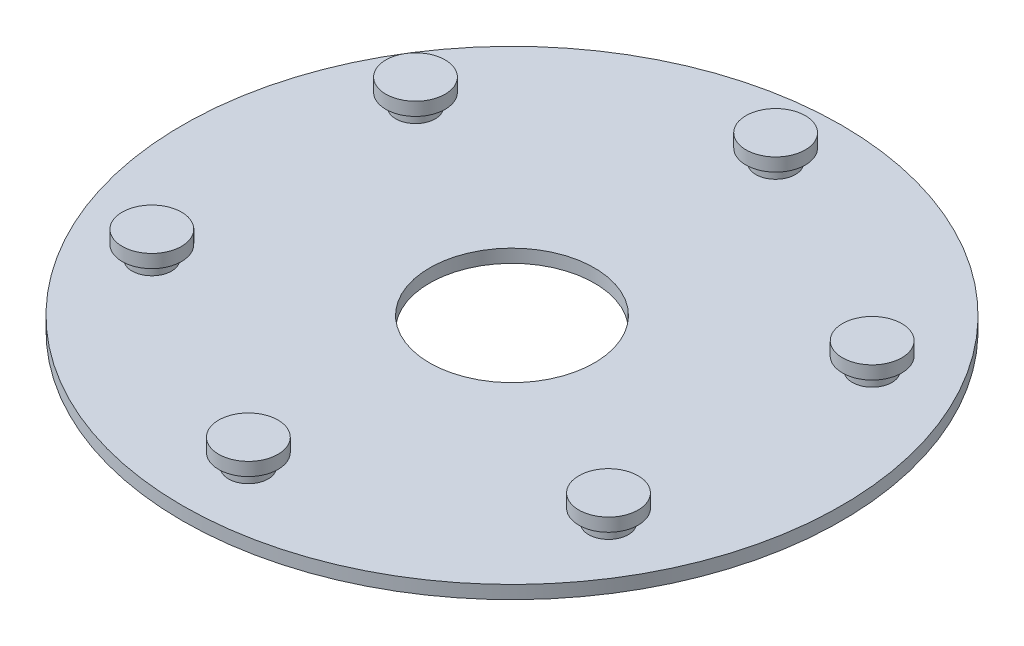
ISO-10303-21;
HEADER;
FILE_DESCRIPTION(('STEP AP214'),'2;1');
FILE_NAME('part.step','',(''),(''),'','','');
FILE_SCHEMA(('AUTOMOTIVE_DESIGN { 1 0 10303 214 1 1 1 1 }'));
ENDSEC;
DATA;
#1=APPLICATION_CONTEXT('core data for automotive mechanical design processes');
#2=APPLICATION_PROTOCOL_DEFINITION('international standard','automotive_design',2000,#1);
#3=PRODUCT_CONTEXT('',#1,'mechanical');
#4=PRODUCT('Part','Part','',(#3));
#5=PRODUCT_RELATED_PRODUCT_CATEGORY('part','',(#4));
#6=PRODUCT_DEFINITION_FORMATION('','',#4);
#7=PRODUCT_DEFINITION_CONTEXT('part definition',#1,'design');
#8=PRODUCT_DEFINITION('design','',#6,#7);
#9=PRODUCT_DEFINITION_SHAPE('','',#8);
#10=(LENGTH_UNIT() NAMED_UNIT(*) SI_UNIT(.MILLI.,.METRE.));
#11=(NAMED_UNIT(*) PLANE_ANGLE_UNIT() SI_UNIT($,.RADIAN.));
#12=(NAMED_UNIT(*) SI_UNIT($,.STERADIAN.) SOLID_ANGLE_UNIT());
#13=UNCERTAINTY_MEASURE_WITH_UNIT(LENGTH_MEASURE(1.E-05),#10,'distance_accuracy_value','');
#14=(GEOMETRIC_REPRESENTATION_CONTEXT(3) GLOBAL_UNCERTAINTY_ASSIGNED_CONTEXT((#13)) GLOBAL_UNIT_ASSIGNED_CONTEXT((#10,
#11,#12)) REPRESENTATION_CONTEXT('',''));
#15=CARTESIAN_POINT('',(0.,0.,0.));
#16=DIRECTION('',(0.,0.,1.));
#17=DIRECTION('',(1.,0.,0.));
#18=AXIS2_PLACEMENT_3D('',#15,#16,#17);
#19=CARTESIAN_POINT('',(0.,2.,0.));
#20=DIRECTION('',(0.,-1.,0.));
#21=DIRECTION('',(0.,0.,-1.));
#22=AXIS2_PLACEMENT_3D('',#19,#20,#21);
#23=CYLINDRICAL_SURFACE('',#22,50.);
#24=CARTESIAN_POINT('',(0.,2.,0.));
#25=DIRECTION('',(0.,1.,0.));
#26=DIRECTION('',(0.,0.,1.));
#27=AXIS2_PLACEMENT_3D('',#24,#25,#26);
#28=CIRCLE('',#27,50.);
#29=CARTESIAN_POINT('',(0.,2.,50.));
#30=VERTEX_POINT('',#29);
#31=EDGE_CURVE('E11',#30,#30,#28,.T.);
#32=ORIENTED_EDGE('',*,*,#31,.F.);
#33=EDGE_LOOP('',(#32));
#34=FACE_BOUND('',#33,.T.);
#35=CARTESIAN_POINT('',(0.,0.,0.));
#36=DIRECTION('',(0.,1.,0.));
#37=DIRECTION('',(0.,0.,1.));
#38=AXIS2_PLACEMENT_3D('',#35,#36,#37);
#39=CIRCLE('',#38,50.);
#40=CARTESIAN_POINT('',(0.,0.,50.));
#41=VERTEX_POINT('',#40);
#42=EDGE_CURVE('E73',#41,#41,#39,.T.);
#43=ORIENTED_EDGE('',*,*,#42,.T.);
#44=EDGE_LOOP('',(#43));
#45=FACE_BOUND('',#44,.T.);
#46=ADVANCED_FACE('F70',(#34,#45),#23,.T.);
#47=CARTESIAN_POINT('',(0.,2.,0.));
#48=DIRECTION('',(0.,1.,0.));
#49=DIRECTION('',(0.,0.,1.));
#50=AXIS2_PLACEMENT_3D('',#47,#48,#49);
#51=PLANE('',#50);
#52=CARTESIAN_POINT('',(0.,2.,0.));
#53=DIRECTION('',(0.,1.,0.));
#54=DIRECTION('',(0.,0.,1.));
#55=AXIS2_PLACEMENT_3D('',#52,#53,#54);
#56=CIRCLE('',#55,12.5);
#57=CARTESIAN_POINT('',(0.,2.,12.5));
#58=VERTEX_POINT('',#57);
#59=EDGE_CURVE('E88',#58,#58,#56,.T.);
#60=ORIENTED_EDGE('',*,*,#59,.F.);
#61=EDGE_LOOP('',(#60));
#62=FACE_BOUND('',#61,.T.);
#63=ORIENTED_EDGE('',*,*,#31,.T.);
#64=EDGE_LOOP('',(#63));
#65=FACE_BOUND('',#64,.T.);
#66=CARTESIAN_POINT('',(0.,2.,40.));
#67=DIRECTION('',(0.,1.,0.));
#68=DIRECTION('',(0.,0.,1.));
#69=AXIS2_PLACEMENT_3D('',#66,#67,#68);
#70=CIRCLE('',#69,3.);
#71=CARTESIAN_POINT('',(0.,2.,43.));
#72=VERTEX_POINT('',#71);
#73=EDGE_CURVE('E101',#72,#72,#70,.T.);
#74=ORIENTED_EDGE('',*,*,#73,.F.);
#75=EDGE_LOOP('',(#74));
#76=FACE_BOUND('',#75,.T.);
#77=CARTESIAN_POINT('',(-34.6410161513773,2.,20.0000000000004));
#78=DIRECTION('',(0.,1.,0.));
#79=DIRECTION('',(-0.866025403784433,0.,0.50000000000001));
#80=AXIS2_PLACEMENT_3D('',#77,#78,#79);
#81=CIRCLE('',#80,3.);
#82=CARTESIAN_POINT('',(-37.2390923627306,2.,21.5000000000004));
#83=VERTEX_POINT('',#82);
#84=EDGE_CURVE('E147',#83,#83,#81,.T.);
#85=ORIENTED_EDGE('',*,*,#84,.F.);
#86=EDGE_LOOP('',(#85));
#87=FACE_BOUND('',#86,.T.);
#88=CARTESIAN_POINT('',(-34.6410161513777,2.,-19.9999999999997));
#89=DIRECTION('',(0.,1.,0.));
#90=DIRECTION('',(-0.866025403784443,0.,-0.499999999999992));
#91=AXIS2_PLACEMENT_3D('',#88,#89,#90);
#92=CIRCLE('',#91,3.);
#93=CARTESIAN_POINT('',(-37.2390923627311,2.,-21.4999999999997));
#94=VERTEX_POINT('',#93);
#95=EDGE_CURVE('E145',#94,#94,#92,.T.);
#96=ORIENTED_EDGE('',*,*,#95,.F.);
#97=EDGE_LOOP('',(#96));
#98=FACE_BOUND('',#97,.T.);
#99=CARTESIAN_POINT('',(0.,2.,-40.));
#100=DIRECTION('',(0.,1.,0.));
#101=DIRECTION('',(0.,0.,-1.));
#102=AXIS2_PLACEMENT_3D('',#99,#100,#101);
#103=CIRCLE('',#102,3.);
#104=CARTESIAN_POINT('',(0.,2.,-43.));
#105=VERTEX_POINT('',#104);
#106=EDGE_CURVE('E158',#105,#105,#103,.T.);
#107=ORIENTED_EDGE('',*,*,#106,.F.);
#108=EDGE_LOOP('',(#107));
#109=FACE_BOUND('',#108,.T.);
#110=CARTESIAN_POINT('',(34.6410161513775,2.,-20.0000000000002));
#111=DIRECTION('',(0.,1.,0.));
#112=DIRECTION('',(0.866025403784436,0.,-0.500000000000004));
#113=AXIS2_PLACEMENT_3D('',#110,#111,#112);
#114=CIRCLE('',#113,3.);
#115=CARTESIAN_POINT('',(37.2390923627308,2.,-21.5000000000002));
#116=VERTEX_POINT('',#115);
#117=EDGE_CURVE('E170',#116,#116,#114,.T.);
#118=ORIENTED_EDGE('',*,*,#117,.F.);
#119=EDGE_LOOP('',(#118));
#120=FACE_BOUND('',#119,.T.);
#121=CARTESIAN_POINT('',(34.6410161513776,2.,19.9999999999999));
#122=DIRECTION('',(0.,1.,0.));
#123=DIRECTION('',(0.86602540378444,0.,0.499999999999998));
#124=AXIS2_PLACEMENT_3D('',#121,#122,#123);
#125=CIRCLE('',#124,3.);
#126=CARTESIAN_POINT('',(37.2390923627309,2.,21.4999999999999));
#127=VERTEX_POINT('',#126);
#128=EDGE_CURVE('E133',#127,#127,#125,.T.);
#129=ORIENTED_EDGE('',*,*,#128,.F.);
#130=EDGE_LOOP('',(#129));
#131=FACE_BOUND('',#130,.T.);
#132=ADVANCED_FACE('F199',(#62,#65,#76,#87,#98,#109,#120,#131),#51,.T.);
#133=CARTESIAN_POINT('',(0.,0.,0.));
#134=DIRECTION('',(0.,1.,0.));
#135=DIRECTION('',(0.,0.,1.));
#136=AXIS2_PLACEMENT_3D('',#133,#134,#135);
#137=PLANE('',#136);
#138=CARTESIAN_POINT('',(0.,0.,0.));
#139=DIRECTION('',(0.,1.,0.));
#140=DIRECTION('',(0.,0.,1.));
#141=AXIS2_PLACEMENT_3D('',#138,#139,#140);
#142=CIRCLE('',#141,12.5);
#143=CARTESIAN_POINT('',(0.,0.,12.5));
#144=VERTEX_POINT('',#143);
#145=EDGE_CURVE('E83',#144,#144,#142,.F.);
#146=ORIENTED_EDGE('',*,*,#145,.F.);
#147=EDGE_LOOP('',(#146));
#148=FACE_BOUND('',#147,.T.);
#149=ORIENTED_EDGE('',*,*,#42,.F.);
#150=EDGE_LOOP('',(#149));
#151=FACE_BOUND('',#150,.T.);
#152=ADVANCED_FACE('F202',(#148,#151),#137,.F.);
#153=CARTESIAN_POINT('',(0.,-35.3553390593274,0.));
#154=DIRECTION('',(0.,1.,0.));
#155=DIRECTION('',(0.,0.,1.));
#156=AXIS2_PLACEMENT_3D('',#153,#154,#155);
#157=CYLINDRICAL_SURFACE('',#156,12.5);
#158=ORIENTED_EDGE('',*,*,#145,.T.);
#159=EDGE_LOOP('',(#158));
#160=FACE_BOUND('',#159,.T.);
#161=ORIENTED_EDGE('',*,*,#59,.T.);
#162=EDGE_LOOP('',(#161));
#163=FACE_BOUND('',#162,.T.);
#164=ADVANCED_FACE('F233',(#160,#163),#157,.F.);
#165=CARTESIAN_POINT('',(0.,4.,40.));
#166=DIRECTION('',(0.,1.,0.));
#167=DIRECTION('',(0.,0.,1.));
#168=AXIS2_PLACEMENT_3D('',#165,#166,#167);
#169=PLANE('',#168);
#170=CARTESIAN_POINT('',(0.,4.,40.));
#171=DIRECTION('',(0.,1.,0.));
#172=DIRECTION('',(0.,0.,1.));
#173=AXIS2_PLACEMENT_3D('',#170,#171,#172);
#174=CIRCLE('',#173,4.5);
#175=CARTESIAN_POINT('',(0.,4.,44.5));
#176=VERTEX_POINT('',#175);
#177=EDGE_CURVE('E96',#176,#176,#174,.T.);
#178=ORIENTED_EDGE('',*,*,#177,.F.);
#179=EDGE_LOOP('',(#178));
#180=FACE_BOUND('',#179,.T.);
#181=CARTESIAN_POINT('',(0.,4.,40.));
#182=DIRECTION('',(0.,1.,0.));
#183=DIRECTION('',(0.,0.,1.));
#184=AXIS2_PLACEMENT_3D('',#181,#182,#183);
#185=CIRCLE('',#184,3.);
#186=CARTESIAN_POINT('',(0.,4.,43.));
#187=VERTEX_POINT('',#186);
#188=EDGE_CURVE('E100',#187,#187,#185,.T.);
#189=ORIENTED_EDGE('',*,*,#188,.T.);
#190=EDGE_LOOP('',(#189));
#191=FACE_BOUND('',#190,.T.);
#192=ADVANCED_FACE('F238',(#180,#191),#169,.F.);
#193=CARTESIAN_POINT('',(0.,4.,40.));
#194=DIRECTION('',(0.,-1.,0.));
#195=DIRECTION('',(0.,0.,-1.));
#196=AXIS2_PLACEMENT_3D('',#193,#194,#195);
#197=CYLINDRICAL_SURFACE('',#196,3.);
#198=ORIENTED_EDGE('',*,*,#188,.F.);
#199=EDGE_LOOP('',(#198));
#200=FACE_BOUND('',#199,.T.);
#201=ORIENTED_EDGE('',*,*,#73,.T.);
#202=EDGE_LOOP('',(#201));
#203=FACE_BOUND('',#202,.T.);
#204=ADVANCED_FACE('F251',(#200,#203),#197,.T.);
#205=CARTESIAN_POINT('',(0.,6.,40.));
#206=DIRECTION('',(0.,1.,0.));
#207=DIRECTION('',(0.,0.,1.));
#208=AXIS2_PLACEMENT_3D('',#205,#206,#207);
#209=PLANE('',#208);
#210=CARTESIAN_POINT('',(0.,6.,40.));
#211=DIRECTION('',(0.,1.,0.));
#212=DIRECTION('',(0.,0.,1.));
#213=AXIS2_PLACEMENT_3D('',#210,#211,#212);
#214=CIRCLE('',#213,4.5);
#215=CARTESIAN_POINT('',(0.,6.,44.5));
#216=VERTEX_POINT('',#215);
#217=EDGE_CURVE('E92',#216,#216,#214,.T.);
#218=ORIENTED_EDGE('',*,*,#217,.T.);
#219=EDGE_LOOP('',(#218));
#220=FACE_BOUND('',#219,.T.);
#221=ADVANCED_FACE('F247',(#220),#209,.T.);
#222=CARTESIAN_POINT('',(0.,6.,40.));
#223=DIRECTION('',(0.,-1.,0.));
#224=DIRECTION('',(0.,0.,-1.));
#225=AXIS2_PLACEMENT_3D('',#222,#223,#224);
#226=CYLINDRICAL_SURFACE('',#225,4.5);
#227=ORIENTED_EDGE('',*,*,#177,.T.);
#228=EDGE_LOOP('',(#227));
#229=FACE_BOUND('',#228,.T.);
#230=ORIENTED_EDGE('',*,*,#217,.F.);
#231=EDGE_LOOP('',(#230));
#232=FACE_BOUND('',#231,.T.);
#233=ADVANCED_FACE('F243',(#229,#232),#226,.T.);
#234=CARTESIAN_POINT('',(-34.6410161513773,4.,20.0000000000004));
#235=DIRECTION('',(0.,1.,0.));
#236=DIRECTION('',(-0.866025403784433,0.,0.50000000000001));
#237=AXIS2_PLACEMENT_3D('',#234,#235,#236);
#238=PLANE('',#237);
#239=CARTESIAN_POINT('',(-34.6410161513773,4.,20.0000000000004));
#240=DIRECTION('',(0.,1.,0.));
#241=DIRECTION('',(-0.866025403784433,0.,0.50000000000001));
#242=AXIS2_PLACEMENT_3D('',#239,#240,#241);
#243=CIRCLE('',#242,4.5);
#244=CARTESIAN_POINT('',(-38.5381304684073,4.,22.2500000000004));
#245=VERTEX_POINT('',#244);
#246=EDGE_CURVE('E141',#245,#245,#243,.T.);
#247=ORIENTED_EDGE('',*,*,#246,.F.);
#248=EDGE_LOOP('',(#247));
#249=FACE_BOUND('',#248,.T.);
#250=CARTESIAN_POINT('',(-34.6410161513773,4.,20.0000000000004));
#251=DIRECTION('',(0.,1.,0.));
#252=DIRECTION('',(-0.866025403784433,0.,0.50000000000001));
#253=AXIS2_PLACEMENT_3D('',#250,#251,#252);
#254=CIRCLE('',#253,3.);
#255=CARTESIAN_POINT('',(-37.2390923627306,4.,21.5000000000004));
#256=VERTEX_POINT('',#255);
#257=EDGE_CURVE('E146',#256,#256,#254,.T.);
#258=ORIENTED_EDGE('',*,*,#257,.T.);
#259=EDGE_LOOP('',(#258));
#260=FACE_BOUND('',#259,.T.);
#261=ADVANCED_FACE('F246',(#249,#260),#238,.F.);
#262=CARTESIAN_POINT('',(-34.6410161513773,4.,20.0000000000004));
#263=DIRECTION('',(0.,-1.,0.));
#264=DIRECTION('',(0.,0.,-1.));
#265=AXIS2_PLACEMENT_3D('',#262,#263,#264);
#266=CYLINDRICAL_SURFACE('',#265,3.);
#267=ORIENTED_EDGE('',*,*,#257,.F.);
#268=EDGE_LOOP('',(#267));
#269=FACE_BOUND('',#268,.T.);
#270=ORIENTED_EDGE('',*,*,#84,.T.);
#271=EDGE_LOOP('',(#270));
#272=FACE_BOUND('',#271,.T.);
#273=ADVANCED_FACE('F294',(#269,#272),#266,.T.);
#274=CARTESIAN_POINT('',(-34.6410161513773,6.,20.0000000000004));
#275=DIRECTION('',(0.,1.,0.));
#276=DIRECTION('',(-0.866025403784433,0.,0.50000000000001));
#277=AXIS2_PLACEMENT_3D('',#274,#275,#276);
#278=PLANE('',#277);
#279=CARTESIAN_POINT('',(-34.6410161513773,6.,20.0000000000004));
#280=DIRECTION('',(0.,1.,0.));
#281=DIRECTION('',(-0.866025403784433,0.,0.50000000000001));
#282=AXIS2_PLACEMENT_3D('',#279,#280,#281);
#283=CIRCLE('',#282,4.5);
#284=CARTESIAN_POINT('',(-38.5381304684073,6.,22.2500000000004));
#285=VERTEX_POINT('',#284);
#286=EDGE_CURVE('E124',#285,#285,#283,.T.);
#287=ORIENTED_EDGE('',*,*,#286,.T.);
#288=EDGE_LOOP('',(#287));
#289=FACE_BOUND('',#288,.T.);
#290=ADVANCED_FACE('F291',(#289),#278,.T.);
#291=CARTESIAN_POINT('',(-34.6410161513773,6.,20.0000000000004));
#292=DIRECTION('',(0.,-1.,0.));
#293=DIRECTION('',(0.,0.,-1.));
#294=AXIS2_PLACEMENT_3D('',#291,#292,#293);
#295=CYLINDRICAL_SURFACE('',#294,4.5);
#296=ORIENTED_EDGE('',*,*,#246,.T.);
#297=EDGE_LOOP('',(#296));
#298=FACE_BOUND('',#297,.T.);
#299=ORIENTED_EDGE('',*,*,#286,.F.);
#300=EDGE_LOOP('',(#299));
#301=FACE_BOUND('',#300,.T.);
#302=ADVANCED_FACE('F287',(#298,#301),#295,.T.);
#303=CARTESIAN_POINT('',(-34.6410161513777,4.,-19.9999999999997));
#304=DIRECTION('',(0.,1.,0.));
#305=DIRECTION('',(-0.866025403784443,0.,-0.499999999999992));
#306=AXIS2_PLACEMENT_3D('',#303,#304,#305);
#307=PLANE('',#306);
#308=CARTESIAN_POINT('',(-34.6410161513777,4.,-19.9999999999997));
#309=DIRECTION('',(0.,1.,0.));
#310=DIRECTION('',(-0.866025403784443,0.,-0.499999999999992));
#311=AXIS2_PLACEMENT_3D('',#308,#309,#310);
#312=CIRCLE('',#311,4.5);
#313=CARTESIAN_POINT('',(-38.5381304684077,4.,-22.2499999999996));
#314=VERTEX_POINT('',#313);
#315=EDGE_CURVE('E154',#314,#314,#312,.T.);
#316=ORIENTED_EDGE('',*,*,#315,.F.);
#317=EDGE_LOOP('',(#316));
#318=FACE_BOUND('',#317,.T.);
#319=CARTESIAN_POINT('',(-34.6410161513777,4.,-19.9999999999997));
#320=DIRECTION('',(0.,1.,0.));
#321=DIRECTION('',(-0.866025403784443,0.,-0.499999999999992));
#322=AXIS2_PLACEMENT_3D('',#319,#320,#321);
#323=CIRCLE('',#322,3.);
#324=CARTESIAN_POINT('',(-37.2390923627311,4.,-21.4999999999997));
#325=VERTEX_POINT('',#324);
#326=EDGE_CURVE('E159',#325,#325,#323,.T.);
#327=ORIENTED_EDGE('',*,*,#326,.T.);
#328=EDGE_LOOP('',(#327));
#329=FACE_BOUND('',#328,.T.);
#330=ADVANCED_FACE('F290',(#318,#329),#307,.F.);
#331=CARTESIAN_POINT('',(-34.6410161513777,4.,-19.9999999999997));
#332=DIRECTION('',(0.,-1.,0.));
#333=DIRECTION('',(0.,0.,-1.));
#334=AXIS2_PLACEMENT_3D('',#331,#332,#333);
#335=CYLINDRICAL_SURFACE('',#334,3.);
#336=ORIENTED_EDGE('',*,*,#326,.F.);
#337=EDGE_LOOP('',(#336));
#338=FACE_BOUND('',#337,.T.);
#339=ORIENTED_EDGE('',*,*,#95,.T.);
#340=EDGE_LOOP('',(#339));
#341=FACE_BOUND('',#340,.T.);
#342=ADVANCED_FACE('F285',(#338,#341),#335,.T.);
#343=CARTESIAN_POINT('',(-34.6410161513777,6.,-19.9999999999997));
#344=DIRECTION('',(0.,1.,0.));
#345=DIRECTION('',(-0.866025403784443,0.,-0.499999999999992));
#346=AXIS2_PLACEMENT_3D('',#343,#344,#345);
#347=PLANE('',#346);
#348=CARTESIAN_POINT('',(-34.6410161513777,6.,-19.9999999999997));
#349=DIRECTION('',(0.,1.,0.));
#350=DIRECTION('',(-0.866025403784443,0.,-0.499999999999992));
#351=AXIS2_PLACEMENT_3D('',#348,#349,#350);
#352=CIRCLE('',#351,4.5);
#353=CARTESIAN_POINT('',(-38.5381304684077,6.,-22.2499999999996));
#354=VERTEX_POINT('',#353);
#355=EDGE_CURVE('E120',#354,#354,#352,.T.);
#356=ORIENTED_EDGE('',*,*,#355,.T.);
#357=EDGE_LOOP('',(#356));
#358=FACE_BOUND('',#357,.T.);
#359=ADVANCED_FACE('F281',(#358),#347,.T.);
#360=CARTESIAN_POINT('',(-34.6410161513777,6.,-19.9999999999997));
#361=DIRECTION('',(0.,-1.,0.));
#362=DIRECTION('',(0.,0.,-1.));
#363=AXIS2_PLACEMENT_3D('',#360,#361,#362);
#364=CYLINDRICAL_SURFACE('',#363,4.5);
#365=ORIENTED_EDGE('',*,*,#315,.T.);
#366=EDGE_LOOP('',(#365));
#367=FACE_BOUND('',#366,.T.);
#368=ORIENTED_EDGE('',*,*,#355,.F.);
#369=EDGE_LOOP('',(#368));
#370=FACE_BOUND('',#369,.T.);
#371=ADVANCED_FACE('F277',(#367,#370),#364,.T.);
#372=CARTESIAN_POINT('',(0.,4.,-40.));
#373=DIRECTION('',(0.,1.,0.));
#374=DIRECTION('',(0.,0.,-1.));
#375=AXIS2_PLACEMENT_3D('',#372,#373,#374);
#376=PLANE('',#375);
#377=CARTESIAN_POINT('',(0.,4.,-40.));
#378=DIRECTION('',(0.,1.,0.));
#379=DIRECTION('',(0.,0.,-1.));
#380=AXIS2_PLACEMENT_3D('',#377,#378,#379);
#381=CIRCLE('',#380,4.5);
#382=CARTESIAN_POINT('',(0.,4.,-44.5));
#383=VERTEX_POINT('',#382);
#384=EDGE_CURVE('E166',#383,#383,#381,.T.);
#385=ORIENTED_EDGE('',*,*,#384,.F.);
#386=EDGE_LOOP('',(#385));
#387=FACE_BOUND('',#386,.T.);
#388=CARTESIAN_POINT('',(0.,4.,-40.));
#389=DIRECTION('',(0.,1.,0.));
#390=DIRECTION('',(0.,0.,-1.));
#391=AXIS2_PLACEMENT_3D('',#388,#389,#390);
#392=CIRCLE('',#391,3.);
#393=CARTESIAN_POINT('',(0.,4.,-43.));
#394=VERTEX_POINT('',#393);
#395=EDGE_CURVE('E171',#394,#394,#392,.T.);
#396=ORIENTED_EDGE('',*,*,#395,.T.);
#397=EDGE_LOOP('',(#396));
#398=FACE_BOUND('',#397,.T.);
#399=ADVANCED_FACE('F280',(#387,#398),#376,.F.);
#400=CARTESIAN_POINT('',(0.,4.,-40.));
#401=DIRECTION('',(0.,-1.,0.));
#402=DIRECTION('',(0.,0.,-1.));
#403=AXIS2_PLACEMENT_3D('',#400,#401,#402);
#404=CYLINDRICAL_SURFACE('',#403,3.);
#405=ORIENTED_EDGE('',*,*,#395,.F.);
#406=EDGE_LOOP('',(#405));
#407=FACE_BOUND('',#406,.T.);
#408=ORIENTED_EDGE('',*,*,#106,.T.);
#409=EDGE_LOOP('',(#408));
#410=FACE_BOUND('',#409,.T.);
#411=ADVANCED_FACE('F275',(#407,#410),#404,.T.);
#412=CARTESIAN_POINT('',(0.,6.,-40.));
#413=DIRECTION('',(0.,1.,0.));
#414=DIRECTION('',(0.,0.,-1.));
#415=AXIS2_PLACEMENT_3D('',#412,#413,#414);
#416=PLANE('',#415);
#417=CARTESIAN_POINT('',(0.,6.,-40.));
#418=DIRECTION('',(0.,1.,0.));
#419=DIRECTION('',(0.,0.,-1.));
#420=AXIS2_PLACEMENT_3D('',#417,#418,#419);
#421=CIRCLE('',#420,4.5);
#422=CARTESIAN_POINT('',(0.,6.,-44.5));
#423=VERTEX_POINT('',#422);
#424=EDGE_CURVE('E116',#423,#423,#421,.T.);
#425=ORIENTED_EDGE('',*,*,#424,.T.);
#426=EDGE_LOOP('',(#425));
#427=FACE_BOUND('',#426,.T.);
#428=ADVANCED_FACE('F271',(#427),#416,.T.);
#429=CARTESIAN_POINT('',(0.,6.,-40.));
#430=DIRECTION('',(0.,-1.,0.));
#431=DIRECTION('',(0.,0.,-1.));
#432=AXIS2_PLACEMENT_3D('',#429,#430,#431);
#433=CYLINDRICAL_SURFACE('',#432,4.5);
#434=ORIENTED_EDGE('',*,*,#384,.T.);
#435=EDGE_LOOP('',(#434));
#436=FACE_BOUND('',#435,.T.);
#437=ORIENTED_EDGE('',*,*,#424,.F.);
#438=EDGE_LOOP('',(#437));
#439=FACE_BOUND('',#438,.T.);
#440=ADVANCED_FACE('F268',(#436,#439),#433,.T.);
#441=CARTESIAN_POINT('',(34.6410161513775,4.,-20.0000000000002));
#442=DIRECTION('',(0.,1.,0.));
#443=DIRECTION('',(0.866025403784436,0.,-0.500000000000004));
#444=AXIS2_PLACEMENT_3D('',#441,#442,#443);
#445=PLANE('',#444);
#446=CARTESIAN_POINT('',(34.6410161513775,4.,-20.0000000000002));
#447=DIRECTION('',(0.,1.,0.));
#448=DIRECTION('',(0.866025403784436,0.,-0.500000000000004));
#449=AXIS2_PLACEMENT_3D('',#446,#447,#448);
#450=CIRCLE('',#449,4.5);
#451=CARTESIAN_POINT('',(38.5381304684074,4.,-22.2500000000002));
#452=VERTEX_POINT('',#451);
#453=EDGE_CURVE('E137',#452,#452,#450,.T.);
#454=ORIENTED_EDGE('',*,*,#453,.F.);
#455=EDGE_LOOP('',(#454));
#456=FACE_BOUND('',#455,.T.);
#457=CARTESIAN_POINT('',(34.6410161513775,4.,-20.0000000000002));
#458=DIRECTION('',(0.,1.,0.));
#459=DIRECTION('',(0.866025403784436,0.,-0.500000000000004));
#460=AXIS2_PLACEMENT_3D('',#457,#458,#459);
#461=CIRCLE('',#460,3.);
#462=CARTESIAN_POINT('',(37.2390923627308,4.,-21.5000000000002));
#463=VERTEX_POINT('',#462);
#464=EDGE_CURVE('E181',#463,#463,#461,.T.);
#465=ORIENTED_EDGE('',*,*,#464,.T.);
#466=EDGE_LOOP('',(#465));
#467=FACE_BOUND('',#466,.T.);
#468=ADVANCED_FACE('F190',(#456,#467),#445,.F.);
#469=CARTESIAN_POINT('',(34.6410161513775,4.,-20.0000000000002));
#470=DIRECTION('',(0.,-1.,0.));
#471=DIRECTION('',(0.,0.,-1.));
#472=AXIS2_PLACEMENT_3D('',#469,#470,#471);
#473=CYLINDRICAL_SURFACE('',#472,3.);
#474=ORIENTED_EDGE('',*,*,#464,.F.);
#475=EDGE_LOOP('',(#474));
#476=FACE_BOUND('',#475,.T.);
#477=ORIENTED_EDGE('',*,*,#117,.T.);
#478=EDGE_LOOP('',(#477));
#479=FACE_BOUND('',#478,.T.);
#480=ADVANCED_FACE('F192',(#476,#479),#473,.T.);
#481=CARTESIAN_POINT('',(34.6410161513775,6.,-20.0000000000002));
#482=DIRECTION('',(0.,1.,0.));
#483=DIRECTION('',(0.866025403784436,0.,-0.500000000000004));
#484=AXIS2_PLACEMENT_3D('',#481,#482,#483);
#485=PLANE('',#484);
#486=CARTESIAN_POINT('',(34.6410161513775,6.,-20.0000000000002));
#487=DIRECTION('',(0.,1.,0.));
#488=DIRECTION('',(0.866025403784436,0.,-0.500000000000004));
#489=AXIS2_PLACEMENT_3D('',#486,#487,#488);
#490=CIRCLE('',#489,4.5);
#491=CARTESIAN_POINT('',(38.5381304684074,6.,-22.2500000000002));
#492=VERTEX_POINT('',#491);
#493=EDGE_CURVE('E112',#492,#492,#490,.T.);
#494=ORIENTED_EDGE('',*,*,#493,.T.);
#495=EDGE_LOOP('',(#494));
#496=FACE_BOUND('',#495,.T.);
#497=ADVANCED_FACE('F195',(#496),#485,.T.);
#498=CARTESIAN_POINT('',(34.6410161513775,6.,-20.0000000000002));
#499=DIRECTION('',(0.,-1.,0.));
#500=DIRECTION('',(0.,0.,-1.));
#501=AXIS2_PLACEMENT_3D('',#498,#499,#500);
#502=CYLINDRICAL_SURFACE('',#501,4.5);
#503=ORIENTED_EDGE('',*,*,#453,.T.);
#504=EDGE_LOOP('',(#503));
#505=FACE_BOUND('',#504,.T.);
#506=ORIENTED_EDGE('',*,*,#493,.F.);
#507=EDGE_LOOP('',(#506));
#508=FACE_BOUND('',#507,.T.);
#509=ADVANCED_FACE('F220',(#505,#508),#502,.T.);
#510=CARTESIAN_POINT('',(34.6410161513776,4.,19.9999999999999));
#511=DIRECTION('',(0.,1.,0.));
#512=DIRECTION('',(0.86602540378444,0.,0.499999999999998));
#513=AXIS2_PLACEMENT_3D('',#510,#511,#512);
#514=PLANE('',#513);
#515=CARTESIAN_POINT('',(34.6410161513776,4.,19.9999999999999));
#516=DIRECTION('',(0.,1.,0.));
#517=DIRECTION('',(0.86602540378444,0.,0.499999999999998));
#518=AXIS2_PLACEMENT_3D('',#515,#516,#517);
#519=CIRCLE('',#518,4.5);
#520=CARTESIAN_POINT('',(38.5381304684076,4.,22.2499999999999));
#521=VERTEX_POINT('',#520);
#522=EDGE_CURVE('E128',#521,#521,#519,.T.);
#523=ORIENTED_EDGE('',*,*,#522,.F.);
#524=EDGE_LOOP('',(#523));
#525=FACE_BOUND('',#524,.T.);
#526=CARTESIAN_POINT('',(34.6410161513776,4.,19.9999999999999));
#527=DIRECTION('',(0.,1.,0.));
#528=DIRECTION('',(0.86602540378444,0.,0.499999999999998));
#529=AXIS2_PLACEMENT_3D('',#526,#527,#528);
#530=CIRCLE('',#529,3.);
#531=CARTESIAN_POINT('',(37.2390923627309,4.,21.4999999999999));
#532=VERTEX_POINT('',#531);
#533=EDGE_CURVE('E132',#532,#532,#530,.T.);
#534=ORIENTED_EDGE('',*,*,#533,.T.);
#535=EDGE_LOOP('',(#534));
#536=FACE_BOUND('',#535,.T.);
#537=ADVANCED_FACE('F210',(#525,#536),#514,.F.);
#538=CARTESIAN_POINT('',(34.6410161513776,4.,19.9999999999999));
#539=DIRECTION('',(0.,-1.,0.));
#540=DIRECTION('',(0.,0.,-1.));
#541=AXIS2_PLACEMENT_3D('',#538,#539,#540);
#542=CYLINDRICAL_SURFACE('',#541,3.);
#543=ORIENTED_EDGE('',*,*,#533,.F.);
#544=EDGE_LOOP('',(#543));
#545=FACE_BOUND('',#544,.T.);
#546=ORIENTED_EDGE('',*,*,#128,.T.);
#547=EDGE_LOOP('',(#546));
#548=FACE_BOUND('',#547,.T.);
#549=ADVANCED_FACE('F207',(#545,#548),#542,.T.);
#550=CARTESIAN_POINT('',(34.6410161513776,6.,19.9999999999999));
#551=DIRECTION('',(0.,1.,0.));
#552=DIRECTION('',(0.86602540378444,0.,0.499999999999998));
#553=AXIS2_PLACEMENT_3D('',#550,#551,#552);
#554=PLANE('',#553);
#555=CARTESIAN_POINT('',(34.6410161513776,6.,19.9999999999999));
#556=DIRECTION('',(0.,1.,0.));
#557=DIRECTION('',(0.86602540378444,0.,0.499999999999998));
#558=AXIS2_PLACEMENT_3D('',#555,#556,#557);
#559=CIRCLE('',#558,4.5);
#560=CARTESIAN_POINT('',(38.5381304684076,6.,22.2499999999999));
#561=VERTEX_POINT('',#560);
#562=EDGE_CURVE('E105',#561,#561,#559,.T.);
#563=ORIENTED_EDGE('',*,*,#562,.T.);
#564=EDGE_LOOP('',(#563));
#565=FACE_BOUND('',#564,.T.);
#566=ADVANCED_FACE('F209',(#565),#554,.T.);
#567=CARTESIAN_POINT('',(34.6410161513776,6.,19.9999999999999));
#568=DIRECTION('',(0.,-1.,0.));
#569=DIRECTION('',(0.,0.,-1.));
#570=AXIS2_PLACEMENT_3D('',#567,#568,#569);
#571=CYLINDRICAL_SURFACE('',#570,4.5);
#572=ORIENTED_EDGE('',*,*,#522,.T.);
#573=EDGE_LOOP('',(#572));
#574=FACE_BOUND('',#573,.T.);
#575=ORIENTED_EDGE('',*,*,#562,.F.);
#576=EDGE_LOOP('',(#575));
#577=FACE_BOUND('',#576,.T.);
#578=ADVANCED_FACE('F217',(#574,#577),#571,.T.);
#579=CLOSED_SHELL('',(#46,#132,#152,#164,#192,#204,#221,#233,#261,#273,#290,#302,#330,#342,#359,
#371,#399,#411,#428,#440,#468,#480,#497,#509,#537,#549,#566,#578));
#580=MANIFOLD_SOLID_BREP('B2',#579);
#581=ADVANCED_BREP_SHAPE_REPRESENTATION('',(#18,#580),#14);
#582=SHAPE_DEFINITION_REPRESENTATION(#9,#581);
ENDSEC;
END-ISO-10303-21;
